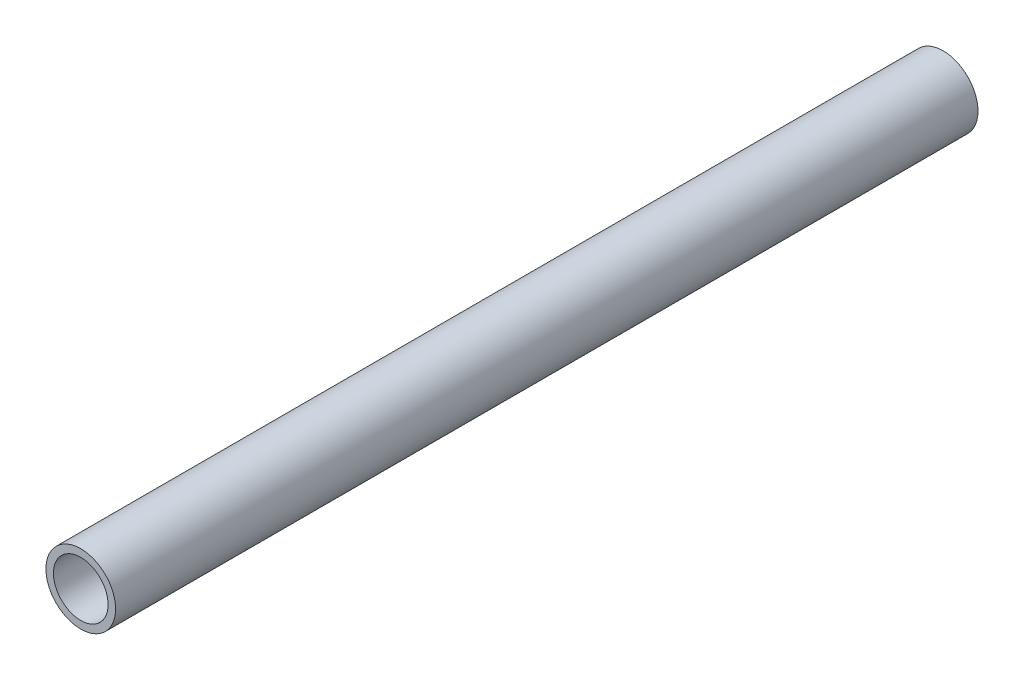
ISO-10303-21;
HEADER;
FILE_DESCRIPTION(('STEP AP214'),'2;1');
FILE_NAME('part.step','',(''),(''),'','','');
FILE_SCHEMA(('AUTOMOTIVE_DESIGN { 1 0 10303 214 1 1 1 1 }'));
ENDSEC;
DATA;
#1=APPLICATION_CONTEXT('core data for automotive mechanical design processes');
#2=APPLICATION_PROTOCOL_DEFINITION('international standard','automotive_design',2000,#1);
#3=PRODUCT_CONTEXT('',#1,'mechanical');
#4=PRODUCT('Part','Part','',(#3));
#5=PRODUCT_RELATED_PRODUCT_CATEGORY('part','',(#4));
#6=PRODUCT_DEFINITION_FORMATION('','',#4);
#7=PRODUCT_DEFINITION_CONTEXT('part definition',#1,'design');
#8=PRODUCT_DEFINITION('design','',#6,#7);
#9=PRODUCT_DEFINITION_SHAPE('','',#8);
#10=(LENGTH_UNIT() NAMED_UNIT(*) SI_UNIT(.MILLI.,.METRE.));
#11=(NAMED_UNIT(*) PLANE_ANGLE_UNIT() SI_UNIT($,.RADIAN.));
#12=(NAMED_UNIT(*) SI_UNIT($,.STERADIAN.) SOLID_ANGLE_UNIT());
#13=UNCERTAINTY_MEASURE_WITH_UNIT(LENGTH_MEASURE(1.E-05),#10,'distance_accuracy_value','');
#14=(GEOMETRIC_REPRESENTATION_CONTEXT(3) GLOBAL_UNCERTAINTY_ASSIGNED_CONTEXT((#13)) GLOBAL_UNIT_ASSIGNED_CONTEXT((#10,
#11,#12)) REPRESENTATION_CONTEXT('',''));
#15=CARTESIAN_POINT('',(0.,0.,0.));
#16=DIRECTION('',(0.,0.,1.));
#17=DIRECTION('',(1.,0.,0.));
#18=AXIS2_PLACEMENT_3D('',#15,#16,#17);
#19=CARTESIAN_POINT('',(0.,0.,330.2));
#20=DIRECTION('',(0.,0.,1.));
#21=DIRECTION('',(1.,0.,0.));
#22=AXIS2_PLACEMENT_3D('',#19,#20,#21);
#23=PLANE('',#22);
#24=CARTESIAN_POINT('',(0.,0.,330.2));
#25=DIRECTION('',(0.,0.,1.));
#26=DIRECTION('',(1.,0.,0.));
#27=AXIS2_PLACEMENT_3D('',#24,#25,#26);
#28=CIRCLE('',#27,13.335);
#29=CARTESIAN_POINT('',(13.335,0.,330.2));
#30=VERTEX_POINT('',#29);
#31=EDGE_CURVE('E10',#30,#30,#28,.T.);
#32=ORIENTED_EDGE('',*,*,#31,.T.);
#33=EDGE_LOOP('',(#32));
#34=FACE_BOUND('',#33,.T.);
#35=CARTESIAN_POINT('',(0.,0.,330.2));
#36=DIRECTION('',(0.,0.,1.));
#37=DIRECTION('',(1.,0.,0.));
#38=AXIS2_PLACEMENT_3D('',#35,#36,#37);
#39=CIRCLE('',#38,10.4648);
#40=CARTESIAN_POINT('',(10.4648,0.,330.2));
#41=VERTEX_POINT('',#40);
#42=EDGE_CURVE('E46',#41,#41,#39,.T.);
#43=ORIENTED_EDGE('',*,*,#42,.F.);
#44=EDGE_LOOP('',(#43));
#45=FACE_BOUND('',#44,.T.);
#46=ADVANCED_FACE('F35',(#34,#45),#23,.T.);
#47=CARTESIAN_POINT('',(0.,0.,0.));
#48=DIRECTION('',(0.,0.,1.));
#49=DIRECTION('',(1.,0.,0.));
#50=AXIS2_PLACEMENT_3D('',#47,#48,#49);
#51=PLANE('',#50);
#52=CARTESIAN_POINT('',(0.,0.,0.));
#53=DIRECTION('',(0.,0.,1.));
#54=DIRECTION('',(1.,0.,0.));
#55=AXIS2_PLACEMENT_3D('',#52,#53,#54);
#56=CIRCLE('',#55,13.335);
#57=CARTESIAN_POINT('',(13.335,0.,0.));
#58=VERTEX_POINT('',#57);
#59=EDGE_CURVE('E39',#58,#58,#56,.T.);
#60=ORIENTED_EDGE('',*,*,#59,.F.);
#61=EDGE_LOOP('',(#60));
#62=FACE_BOUND('',#61,.T.);
#63=CARTESIAN_POINT('',(0.,0.,0.));
#64=DIRECTION('',(0.,0.,1.));
#65=DIRECTION('',(1.,0.,0.));
#66=AXIS2_PLACEMENT_3D('',#63,#64,#65);
#67=CIRCLE('',#66,10.4648);
#68=CARTESIAN_POINT('',(10.4648,0.,0.));
#69=VERTEX_POINT('',#68);
#70=EDGE_CURVE('E48',#69,#69,#67,.T.);
#71=ORIENTED_EDGE('',*,*,#70,.T.);
#72=EDGE_LOOP('',(#71));
#73=FACE_BOUND('',#72,.T.);
#74=ADVANCED_FACE('F58',(#62,#73),#51,.F.);
#75=CARTESIAN_POINT('',(0.,0.,330.2));
#76=DIRECTION('',(0.,0.,-1.));
#77=DIRECTION('',(-1.,0.,0.));
#78=AXIS2_PLACEMENT_3D('',#75,#76,#77);
#79=CYLINDRICAL_SURFACE('',#78,13.335);
#80=ORIENTED_EDGE('',*,*,#31,.F.);
#81=EDGE_LOOP('',(#80));
#82=FACE_BOUND('',#81,.T.);
#83=ORIENTED_EDGE('',*,*,#59,.T.);
#84=EDGE_LOOP('',(#83));
#85=FACE_BOUND('',#84,.T.);
#86=ADVANCED_FACE('F37',(#82,#85),#79,.T.);
#87=CARTESIAN_POINT('',(0.,0.,330.2));
#88=DIRECTION('',(0.,0.,-1.));
#89=DIRECTION('',(-1.,0.,0.));
#90=AXIS2_PLACEMENT_3D('',#87,#88,#89);
#91=CYLINDRICAL_SURFACE('',#90,10.4648);
#92=ORIENTED_EDGE('',*,*,#42,.T.);
#93=EDGE_LOOP('',(#92));
#94=FACE_BOUND('',#93,.T.);
#95=ORIENTED_EDGE('',*,*,#70,.F.);
#96=EDGE_LOOP('',(#95));
#97=FACE_BOUND('',#96,.T.);
#98=ADVANCED_FACE('F54',(#94,#97),#91,.F.);
#99=CLOSED_SHELL('',(#46,#74,#86,#98));
#100=MANIFOLD_SOLID_BREP('B2',#99);
#101=ADVANCED_BREP_SHAPE_REPRESENTATION('',(#18,#100),#14);
#102=SHAPE_DEFINITION_REPRESENTATION(#9,#101);
ENDSEC;
END-ISO-10303-21;
